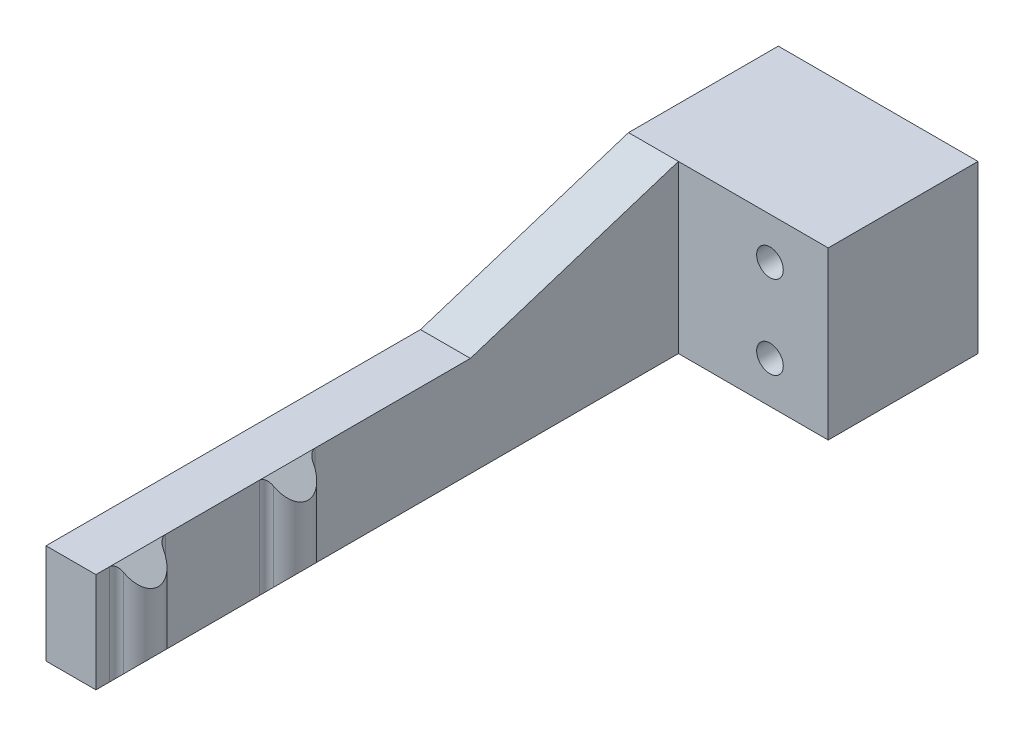
ISO-10303-21;
HEADER;
FILE_DESCRIPTION(('STEP AP214'),'2;1');
FILE_NAME('part.step','',(''),(''),'','','');
FILE_SCHEMA(('AUTOMOTIVE_DESIGN { 1 0 10303 214 1 1 1 1 }'));
ENDSEC;
DATA;
#1=APPLICATION_CONTEXT('core data for automotive mechanical design processes');
#2=APPLICATION_PROTOCOL_DEFINITION('international standard','automotive_design',2000,#1);
#3=PRODUCT_CONTEXT('',#1,'mechanical');
#4=PRODUCT('Part','Part','',(#3));
#5=PRODUCT_RELATED_PRODUCT_CATEGORY('part','',(#4));
#6=PRODUCT_DEFINITION_FORMATION('','',#4);
#7=PRODUCT_DEFINITION_CONTEXT('part definition',#1,'design');
#8=PRODUCT_DEFINITION('design','',#6,#7);
#9=PRODUCT_DEFINITION_SHAPE('','',#8);
#10=(LENGTH_UNIT() NAMED_UNIT(*) SI_UNIT(.MILLI.,.METRE.));
#11=(NAMED_UNIT(*) PLANE_ANGLE_UNIT() SI_UNIT($,.RADIAN.));
#12=(NAMED_UNIT(*) SI_UNIT($,.STERADIAN.) SOLID_ANGLE_UNIT());
#13=UNCERTAINTY_MEASURE_WITH_UNIT(LENGTH_MEASURE(1.E-05),#10,'distance_accuracy_value','');
#14=(GEOMETRIC_REPRESENTATION_CONTEXT(3) GLOBAL_UNCERTAINTY_ASSIGNED_CONTEXT((#13)) GLOBAL_UNIT_ASSIGNED_CONTEXT((#10,
#11,#12)) REPRESENTATION_CONTEXT('',''));
#15=CARTESIAN_POINT('',(0.,0.,0.));
#16=DIRECTION('',(0.,0.,1.));
#17=DIRECTION('',(1.,0.,0.));
#18=AXIS2_PLACEMENT_3D('',#15,#16,#17);
#19=CARTESIAN_POINT('',(-6.,0.,0.));
#20=DIRECTION('',(-1.,0.,0.));
#21=DIRECTION('',(0.,0.,1.));
#22=AXIS2_PLACEMENT_3D('',#19,#20,#21);
#23=PLANE('',#22);
#24=DIRECTION('',(0.,-1.,0.));
#25=VECTOR('',#24,1.);
#26=CARTESIAN_POINT('',(-6.,0.,68.3541019662497));
#27=LINE('',#26,#25);
#28=CARTESIAN_POINT('',(-6.,-10.,68.3541019662497));
#29=VERTEX_POINT('',#28);
#30=CARTESIAN_POINT('',(-6.,2.,68.3541019662497));
#31=VERTEX_POINT('',#30);
#32=EDGE_CURVE('E265',#29,#31,#27,.F.);
#33=ORIENTED_EDGE('',*,*,#32,.T.);
#34=DIRECTION('',(0.,0.,1.));
#35=VECTOR('',#34,1.);
#36=CARTESIAN_POINT('',(-6.,2.,0.));
#37=LINE('',#36,#35);
#38=CARTESIAN_POINT('',(-6.,2.,79.6458980337503));
#39=VERTEX_POINT('',#38);
#40=EDGE_CURVE('E192',#31,#39,#37,.T.);
#41=ORIENTED_EDGE('',*,*,#40,.T.);
#42=DIRECTION('',(0.,-1.,0.));
#43=VECTOR('',#42,1.);
#44=CARTESIAN_POINT('',(-6.,0.,79.6458980337503));
#45=LINE('',#44,#43);
#46=CARTESIAN_POINT('',(-6.,-10.,79.6458980337503));
#47=VERTEX_POINT('',#46);
#48=EDGE_CURVE('E260',#39,#47,#45,.T.);
#49=ORIENTED_EDGE('',*,*,#48,.T.);
#50=DIRECTION('',(0.,0.,1.));
#51=VECTOR('',#50,1.);
#52=CARTESIAN_POINT('',(-6.,-10.,0.));
#53=LINE('',#52,#51);
#54=EDGE_CURVE('E333',#29,#47,#53,.T.);
#55=ORIENTED_EDGE('',*,*,#54,.F.);
#56=EDGE_LOOP('',(#33,#41,#49,#55));
#57=FACE_BOUND('',#56,.T.);
#58=ADVANCED_FACE('F43',(#57),#23,.F.);
#59=CARTESIAN_POINT('',(-6.,-10.,86.3541019662497));
#60=VERTEX_POINT('',#59);
#61=CARTESIAN_POINT('',(-6.,-10.,88.));
#62=VERTEX_POINT('',#61);
#63=EDGE_CURVE('E328',#60,#62,#53,.T.);
#64=ORIENTED_EDGE('',*,*,#63,.F.);
#65=DIRECTION('',(0.,-1.,0.));
#66=VECTOR('',#65,1.);
#67=CARTESIAN_POINT('',(-6.,0.,86.3541019662497));
#68=LINE('',#67,#66);
#69=CARTESIAN_POINT('',(-6.,2.,86.3541019662497));
#70=VERTEX_POINT('',#69);
#71=EDGE_CURVE('E262',#60,#70,#68,.F.);
#72=ORIENTED_EDGE('',*,*,#71,.T.);
#73=CARTESIAN_POINT('',(-6.,2.,88.));
#74=VERTEX_POINT('',#73);
#75=EDGE_CURVE('E193',#70,#74,#37,.T.);
#76=ORIENTED_EDGE('',*,*,#75,.T.);
#77=DIRECTION('',(0.,-1.,0.));
#78=VECTOR('',#77,1.);
#79=CARTESIAN_POINT('',(-6.,0.,88.));
#80=LINE('',#79,#78);
#81=EDGE_CURVE('E187',#74,#62,#80,.T.);
#82=ORIENTED_EDGE('',*,*,#81,.T.);
#83=EDGE_LOOP('',(#64,#72,#76,#82));
#84=FACE_BOUND('',#83,.T.);
#85=ADVANCED_FACE('F355',(#84),#23,.F.);
#86=CARTESIAN_POINT('',(-6.,2.,43.));
#87=VERTEX_POINT('',#86);
#88=CARTESIAN_POINT('',(-6.,2.,61.6458980337503));
#89=VERTEX_POINT('',#88);
#90=EDGE_CURVE('E171',#87,#89,#37,.T.);
#91=ORIENTED_EDGE('',*,*,#90,.T.);
#92=DIRECTION('',(0.,-1.,0.));
#93=VECTOR('',#92,1.);
#94=CARTESIAN_POINT('',(-6.,0.,61.6458980337503));
#95=LINE('',#94,#93);
#96=CARTESIAN_POINT('',(-6.,-10.,61.6458980337503));
#97=VERTEX_POINT('',#96);
#98=EDGE_CURVE('E257',#89,#97,#95,.T.);
#99=ORIENTED_EDGE('',*,*,#98,.T.);
#100=CARTESIAN_POINT('',(-6.,-10.,18.));
#101=VERTEX_POINT('',#100);
#102=EDGE_CURVE('E324',#101,#97,#53,.T.);
#103=ORIENTED_EDGE('',*,*,#102,.F.);
#104=DIRECTION('',(0.,1.,0.));
#105=VECTOR('',#104,1.);
#106=CARTESIAN_POINT('',(-6.,0.,18.));
#107=LINE('',#106,#105);
#108=CARTESIAN_POINT('',(-6.,10.,18.));
#109=VERTEX_POINT('',#108);
#110=EDGE_CURVE('E173',#101,#109,#107,.T.);
#111=ORIENTED_EDGE('',*,*,#110,.T.);
#112=DIRECTION('',(0.,-0.304775727103784,0.952424147199324));
#113=VECTOR('',#112,1.);
#114=CARTESIAN_POINT('',(-6.,14.2960812772134,4.57474600870827));
#115=LINE('',#114,#113);
#116=EDGE_CURVE('E170',#109,#87,#115,.T.);
#117=ORIENTED_EDGE('',*,*,#116,.T.);
#118=EDGE_LOOP('',(#91,#99,#103,#111,#117));
#119=FACE_BOUND('',#118,.T.);
#120=ADVANCED_FACE('F169',(#119),#23,.F.);
#121=CARTESIAN_POINT('',(0.,0.,18.));
#122=DIRECTION('',(0.,0.,-1.));
#123=DIRECTION('',(-1.,0.,0.));
#124=AXIS2_PLACEMENT_3D('',#121,#122,#123);
#125=PLANE('',#124);
#126=CARTESIAN_POINT('',(5.,-5.,18.));
#127=DIRECTION('',(0.,0.,1.));
#128=DIRECTION('',(1.,0.,0.));
#129=AXIS2_PLACEMENT_3D('',#126,#127,#128);
#130=CIRCLE('',#129,1.6);
#131=CARTESIAN_POINT('',(6.6,-5.,18.));
#132=VERTEX_POINT('',#131);
#133=EDGE_CURVE('E213',#132,#132,#130,.T.);
#134=ORIENTED_EDGE('',*,*,#133,.F.);
#135=EDGE_LOOP('',(#134));
#136=FACE_BOUND('',#135,.T.);
#137=CARTESIAN_POINT('',(5.,5.,18.));
#138=DIRECTION('',(0.,0.,1.));
#139=DIRECTION('',(1.,0.,0.));
#140=AXIS2_PLACEMENT_3D('',#137,#138,#139);
#141=CIRCLE('',#140,1.6);
#142=CARTESIAN_POINT('',(6.6,5.,18.));
#143=VERTEX_POINT('',#142);
#144=EDGE_CURVE('E221',#143,#143,#141,.T.);
#145=ORIENTED_EDGE('',*,*,#144,.F.);
#146=EDGE_LOOP('',(#145));
#147=FACE_BOUND('',#146,.T.);
#148=ORIENTED_EDGE('',*,*,#110,.F.);
#149=DIRECTION('',(1.,0.,0.));
#150=VECTOR('',#149,1.);
#151=CARTESIAN_POINT('',(-12.,-10.,18.));
#152=LINE('',#151,#150);
#153=CARTESIAN_POINT('',(12.,-10.,18.));
#154=VERTEX_POINT('',#153);
#155=EDGE_CURVE('E240',#101,#154,#152,.T.);
#156=ORIENTED_EDGE('',*,*,#155,.T.);
#157=DIRECTION('',(0.,1.,0.));
#158=VECTOR('',#157,1.);
#159=CARTESIAN_POINT('',(12.,-10.,18.));
#160=LINE('',#159,#158);
#161=CARTESIAN_POINT('',(12.,10.,18.));
#162=VERTEX_POINT('',#161);
#163=EDGE_CURVE('E233',#154,#162,#160,.T.);
#164=ORIENTED_EDGE('',*,*,#163,.T.);
#165=DIRECTION('',(-1.,0.,0.));
#166=VECTOR('',#165,1.);
#167=CARTESIAN_POINT('',(-12.,10.,18.));
#168=LINE('',#167,#166);
#169=EDGE_CURVE('E234',#162,#109,#168,.T.);
#170=ORIENTED_EDGE('',*,*,#169,.T.);
#171=EDGE_LOOP('',(#148,#156,#164,#170));
#172=FACE_BOUND('',#171,.T.);
#173=ADVANCED_FACE('F360',(#136,#147,#172),#125,.F.);
#174=CARTESIAN_POINT('',(12.,-10.,18.));
#175=DIRECTION('',(-1.,0.,0.));
#176=DIRECTION('',(0.,0.,1.));
#177=AXIS2_PLACEMENT_3D('',#174,#175,#176);
#178=PLANE('',#177);
#179=DIRECTION('',(0.,1.,0.));
#180=VECTOR('',#179,1.);
#181=CARTESIAN_POINT('',(12.,-10.,0.));
#182=LINE('',#181,#180);
#183=CARTESIAN_POINT('',(12.,-10.,0.));
#184=VERTEX_POINT('',#183);
#185=CARTESIAN_POINT('',(12.,10.,0.));
#186=VERTEX_POINT('',#185);
#187=EDGE_CURVE('E225',#184,#186,#182,.T.);
#188=ORIENTED_EDGE('',*,*,#187,.T.);
#189=DIRECTION('',(0.,0.,-1.));
#190=VECTOR('',#189,1.);
#191=CARTESIAN_POINT('',(12.,10.,18.));
#192=LINE('',#191,#190);
#193=EDGE_CURVE('E253',#162,#186,#192,.T.);
#194=ORIENTED_EDGE('',*,*,#193,.F.);
#195=ORIENTED_EDGE('',*,*,#163,.F.);
#196=DIRECTION('',(0.,0.,-1.));
#197=VECTOR('',#196,1.);
#198=CARTESIAN_POINT('',(12.,-10.,18.));
#199=LINE('',#198,#197);
#200=EDGE_CURVE('E237',#154,#184,#199,.T.);
#201=ORIENTED_EDGE('',*,*,#200,.T.);
#202=EDGE_LOOP('',(#188,#194,#195,#201));
#203=FACE_BOUND('',#202,.T.);
#204=ADVANCED_FACE('F379',(#203),#178,.F.);
#205=CARTESIAN_POINT('',(-12.,10.,18.));
#206=DIRECTION('',(0.,-1.,0.));
#207=DIRECTION('',(0.,0.,-1.));
#208=AXIS2_PLACEMENT_3D('',#205,#206,#207);
#209=PLANE('',#208);
#210=DIRECTION('',(-1.,0.,0.));
#211=VECTOR('',#210,1.);
#212=CARTESIAN_POINT('',(-12.,10.,0.));
#213=LINE('',#212,#211);
#214=CARTESIAN_POINT('',(-12.,10.,0.));
#215=VERTEX_POINT('',#214);
#216=EDGE_CURVE('E245',#186,#215,#213,.T.);
#217=ORIENTED_EDGE('',*,*,#216,.T.);
#218=DIRECTION('',(0.,0.,-1.));
#219=VECTOR('',#218,1.);
#220=CARTESIAN_POINT('',(-12.,10.,18.));
#221=LINE('',#220,#219);
#222=CARTESIAN_POINT('',(-12.,10.,18.));
#223=VERTEX_POINT('',#222);
#224=EDGE_CURVE('E255',#223,#215,#221,.T.);
#225=ORIENTED_EDGE('',*,*,#224,.F.);
#226=DIRECTION('',(-1.,0.,0.));
#227=VECTOR('',#226,1.);
#228=CARTESIAN_POINT('',(-6.,10.,18.));
#229=LINE('',#228,#227);
#230=EDGE_CURVE('E184',#109,#223,#229,.T.);
#231=ORIENTED_EDGE('',*,*,#230,.F.);
#232=ORIENTED_EDGE('',*,*,#169,.F.);
#233=ORIENTED_EDGE('',*,*,#193,.T.);
#234=EDGE_LOOP('',(#217,#225,#231,#232,#233));
#235=FACE_BOUND('',#234,.T.);
#236=ADVANCED_FACE('F387',(#235),#209,.F.);
#237=CARTESIAN_POINT('',(-12.,-10.,18.));
#238=DIRECTION('',(1.,0.,0.));
#239=DIRECTION('',(0.,0.,-1.));
#240=AXIS2_PLACEMENT_3D('',#237,#238,#239);
#241=PLANE('',#240);
#242=DIRECTION('',(0.,-1.,0.));
#243=VECTOR('',#242,1.);
#244=CARTESIAN_POINT('',(-12.,-10.,0.));
#245=LINE('',#244,#243);
#246=CARTESIAN_POINT('',(-12.,-10.,0.));
#247=VERTEX_POINT('',#246);
#248=EDGE_CURVE('E242',#215,#247,#245,.T.);
#249=ORIENTED_EDGE('',*,*,#248,.T.);
#250=DIRECTION('',(0.,0.,-1.));
#251=VECTOR('',#250,1.);
#252=CARTESIAN_POINT('',(-12.,-10.,18.));
#253=LINE('',#252,#251);
#254=CARTESIAN_POINT('',(-12.,-10.,88.));
#255=VERTEX_POINT('',#254);
#256=EDGE_CURVE('E248',#255,#247,#253,.T.);
#257=ORIENTED_EDGE('',*,*,#256,.F.);
#258=DIRECTION('',(0.,-1.,0.));
#259=VECTOR('',#258,1.);
#260=CARTESIAN_POINT('',(-12.,0.,88.));
#261=LINE('',#260,#259);
#262=CARTESIAN_POINT('',(-12.,2.,88.));
#263=VERTEX_POINT('',#262);
#264=EDGE_CURVE('E200',#263,#255,#261,.T.);
#265=ORIENTED_EDGE('',*,*,#264,.F.);
#266=DIRECTION('',(0.,0.,1.));
#267=VECTOR('',#266,1.);
#268=CARTESIAN_POINT('',(-12.,2.,0.));
#269=LINE('',#268,#267);
#270=CARTESIAN_POINT('',(-12.,2.,43.));
#271=VERTEX_POINT('',#270);
#272=EDGE_CURVE('E206',#271,#263,#269,.T.);
#273=ORIENTED_EDGE('',*,*,#272,.F.);
#274=DIRECTION('',(0.,-0.304775727103784,0.952424147199324));
#275=VECTOR('',#274,1.);
#276=CARTESIAN_POINT('',(-12.,14.2960812772134,4.57474600870827));
#277=LINE('',#276,#275);
#278=EDGE_CURVE('E181',#223,#271,#277,.T.);
#279=ORIENTED_EDGE('',*,*,#278,.F.);
#280=ORIENTED_EDGE('',*,*,#224,.T.);
#281=EDGE_LOOP('',(#249,#257,#265,#273,#279,#280));
#282=FACE_BOUND('',#281,.T.);
#283=ADVANCED_FACE('F386',(#282),#241,.F.);
#284=CARTESIAN_POINT('',(-12.,-10.,18.));
#285=DIRECTION('',(0.,1.,0.));
#286=DIRECTION('',(0.,0.,1.));
#287=AXIS2_PLACEMENT_3D('',#284,#285,#286);
#288=PLANE('',#287);
#289=DIRECTION('',(1.,0.,0.));
#290=VECTOR('',#289,1.);
#291=CARTESIAN_POINT('',(-12.,-10.,0.));
#292=LINE('',#291,#290);
#293=EDGE_CURVE('E232',#247,#184,#292,.T.);
#294=ORIENTED_EDGE('',*,*,#293,.T.);
#295=ORIENTED_EDGE('',*,*,#200,.F.);
#296=ORIENTED_EDGE('',*,*,#155,.F.);
#297=ORIENTED_EDGE('',*,*,#102,.T.);
#298=EDGE_CURVE('E323',#97,#29,#53,.T.);
#299=ORIENTED_EDGE('',*,*,#298,.T.);
#300=ORIENTED_EDGE('',*,*,#54,.T.);
#301=EDGE_CURVE('E326',#47,#60,#53,.T.);
#302=ORIENTED_EDGE('',*,*,#301,.T.);
#303=ORIENTED_EDGE('',*,*,#63,.T.);
#304=DIRECTION('',(-1.,0.,0.));
#305=VECTOR('',#304,1.);
#306=CARTESIAN_POINT('',(-6.,-10.,88.));
#307=LINE('',#306,#305);
#308=EDGE_CURVE('E212',#62,#255,#307,.T.);
#309=ORIENTED_EDGE('',*,*,#308,.T.);
#310=ORIENTED_EDGE('',*,*,#256,.T.);
#311=EDGE_LOOP('',(#294,#295,#296,#297,#299,#300,#302,#303,#309,#310));
#312=FACE_BOUND('',#311,.T.);
#313=ADVANCED_FACE('F340',(#312),#288,.F.);
#314=CARTESIAN_POINT('',(0.,0.,0.));
#315=DIRECTION('',(0.,0.,-1.));
#316=DIRECTION('',(-1.,0.,0.));
#317=AXIS2_PLACEMENT_3D('',#314,#315,#316);
#318=PLANE('',#317);
#319=CARTESIAN_POINT('',(5.,5.,0.));
#320=DIRECTION('',(0.,0.,1.));
#321=DIRECTION('',(1.,0.,0.));
#322=AXIS2_PLACEMENT_3D('',#319,#320,#321);
#323=CIRCLE('',#322,1.6);
#324=CARTESIAN_POINT('',(6.6,5.,0.));
#325=VERTEX_POINT('',#324);
#326=EDGE_CURVE('E217',#325,#325,#323,.T.);
#327=ORIENTED_EDGE('',*,*,#326,.T.);
#328=EDGE_LOOP('',(#327));
#329=FACE_BOUND('',#328,.T.);
#330=CARTESIAN_POINT('',(5.,-5.,0.));
#331=DIRECTION('',(0.,0.,1.));
#332=DIRECTION('',(1.,0.,0.));
#333=AXIS2_PLACEMENT_3D('',#330,#331,#332);
#334=CIRCLE('',#333,1.6);
#335=CARTESIAN_POINT('',(6.6,-5.,0.));
#336=VERTEX_POINT('',#335);
#337=EDGE_CURVE('E228',#336,#336,#334,.T.);
#338=ORIENTED_EDGE('',*,*,#337,.T.);
#339=EDGE_LOOP('',(#338));
#340=FACE_BOUND('',#339,.T.);
#341=ORIENTED_EDGE('',*,*,#187,.F.);
#342=ORIENTED_EDGE('',*,*,#293,.F.);
#343=ORIENTED_EDGE('',*,*,#248,.F.);
#344=ORIENTED_EDGE('',*,*,#216,.F.);
#345=EDGE_LOOP('',(#341,#342,#343,#344));
#346=FACE_BOUND('',#345,.T.);
#347=ADVANCED_FACE('F376',(#329,#340,#346),#318,.T.);
#348=CARTESIAN_POINT('',(5.,-5.,0.));
#349=DIRECTION('',(0.,0.,1.));
#350=DIRECTION('',(1.,0.,0.));
#351=AXIS2_PLACEMENT_3D('',#348,#349,#350);
#352=CYLINDRICAL_SURFACE('',#351,1.6);
#353=ORIENTED_EDGE('',*,*,#337,.F.);
#354=EDGE_LOOP('',(#353));
#355=FACE_BOUND('',#354,.T.);
#356=ORIENTED_EDGE('',*,*,#133,.T.);
#357=EDGE_LOOP('',(#356));
#358=FACE_BOUND('',#357,.T.);
#359=ADVANCED_FACE('F375',(#355,#358),#352,.F.);
#360=CARTESIAN_POINT('',(5.,5.,0.));
#361=DIRECTION('',(0.,0.,1.));
#362=DIRECTION('',(1.,0.,0.));
#363=AXIS2_PLACEMENT_3D('',#360,#361,#362);
#364=CYLINDRICAL_SURFACE('',#363,1.6);
#365=ORIENTED_EDGE('',*,*,#326,.F.);
#366=EDGE_LOOP('',(#365));
#367=FACE_BOUND('',#366,.T.);
#368=ORIENTED_EDGE('',*,*,#144,.T.);
#369=EDGE_LOOP('',(#368));
#370=FACE_BOUND('',#369,.T.);
#371=ADVANCED_FACE('F367',(#367,#370),#364,.F.);
#372=CARTESIAN_POINT('',(-6.,2.,0.));
#373=DIRECTION('',(0.,-1.,0.));
#374=DIRECTION('',(0.,0.,-1.));
#375=AXIS2_PLACEMENT_3D('',#372,#373,#374);
#376=PLANE('',#375);
#377=ORIENTED_EDGE('',*,*,#272,.T.);
#378=DIRECTION('',(-1.,0.,0.));
#379=VECTOR('',#378,1.);
#380=CARTESIAN_POINT('',(-6.,2.,88.));
#381=LINE('',#380,#379);
#382=EDGE_CURVE('E211',#74,#263,#381,.T.);
#383=ORIENTED_EDGE('',*,*,#382,.F.);
#384=ORIENTED_EDGE('',*,*,#75,.F.);
#385=EDGE_CURVE('E198',#39,#70,#37,.T.);
#386=ORIENTED_EDGE('',*,*,#385,.F.);
#387=ORIENTED_EDGE('',*,*,#40,.F.);
#388=EDGE_CURVE('E191',#89,#31,#37,.T.);
#389=ORIENTED_EDGE('',*,*,#388,.F.);
#390=ORIENTED_EDGE('',*,*,#90,.F.);
#391=DIRECTION('',(-1.,0.,0.));
#392=VECTOR('',#391,1.);
#393=CARTESIAN_POINT('',(-6.,2.,43.));
#394=LINE('',#393,#392);
#395=EDGE_CURVE('E178',#87,#271,#394,.T.);
#396=ORIENTED_EDGE('',*,*,#395,.T.);
#397=EDGE_LOOP('',(#377,#383,#384,#386,#387,#389,#390,#396));
#398=FACE_BOUND('',#397,.T.);
#399=ADVANCED_FACE('F186',(#398),#376,.F.);
#400=CARTESIAN_POINT('',(-6.,0.,88.));
#401=DIRECTION('',(0.,0.,-1.));
#402=DIRECTION('',(-1.,0.,0.));
#403=AXIS2_PLACEMENT_3D('',#400,#401,#402);
#404=PLANE('',#403);
#405=ORIENTED_EDGE('',*,*,#264,.T.);
#406=ORIENTED_EDGE('',*,*,#308,.F.);
#407=ORIENTED_EDGE('',*,*,#81,.F.);
#408=ORIENTED_EDGE('',*,*,#382,.T.);
#409=EDGE_LOOP('',(#405,#406,#407,#408));
#410=FACE_BOUND('',#409,.T.);
#411=ADVANCED_FACE('F316',(#410),#404,.F.);
#412=CARTESIAN_POINT('',(-6.,14.2960812772134,4.57474600870827));
#413=DIRECTION('',(0.,-0.952424147199324,-0.304775727103784));
#414=DIRECTION('',(0.,0.304775727103784,-0.952424147199324));
#415=AXIS2_PLACEMENT_3D('',#412,#413,#414);
#416=PLANE('',#415);
#417=ORIENTED_EDGE('',*,*,#278,.T.);
#418=ORIENTED_EDGE('',*,*,#395,.F.);
#419=ORIENTED_EDGE('',*,*,#116,.F.);
#420=ORIENTED_EDGE('',*,*,#230,.T.);
#421=EDGE_LOOP('',(#417,#418,#419,#420));
#422=FACE_BOUND('',#421,.T.);
#423=ADVANCED_FACE('F177',(#422),#416,.F.);
#424=CARTESIAN_POINT('',(-6.,-0.5,83.));
#425=DIRECTION('',(0.,-1.,0.));
#426=DIRECTION('',(0.,0.,-1.));
#427=AXIS2_PLACEMENT_3D('',#424,#425,#426);
#428=CYLINDRICAL_SURFACE('',#427,2.5);
#429=DIRECTION('',(0.,-1.,0.));
#430=VECTOR('',#429,1.);
#431=CARTESIAN_POINT('',(-5.28571428571429,-0.5,80.6042128812502));
#432=LINE('',#431,#430);
#433=CARTESIAN_POINT('',(-5.28571428571429,-9.28571428571429,80.6042128812502));
#434=VERTEX_POINT('',#433);
#435=CARTESIAN_POINT('',(-5.28571428571429,1.28571428571429,80.6042128812502));
#436=VERTEX_POINT('',#435);
#437=EDGE_CURVE('E59',#434,#436,#432,.F.);
#438=ORIENTED_EDGE('',*,*,#437,.T.);
#439=CARTESIAN_POINT('',(-6.,2.,83.));
#440=DIRECTION('',(0.707106781186543,0.707106781186551,0.));
#441=DIRECTION('',(0.707106781186551,-0.707106781186544,0.));
#442=AXIS2_PLACEMENT_3D('',#439,#440,#441);
#443=ELLIPSE('',#442,3.53553390593272,2.5);
#444=CARTESIAN_POINT('',(-3.49999999999997,-0.5,83.));
#445=VERTEX_POINT('',#444);
#446=EDGE_CURVE('E11',#436,#445,#443,.F.);
#447=ORIENTED_EDGE('',*,*,#446,.T.);
#448=CARTESIAN_POINT('',(-6.,2.,83.));
#449=DIRECTION('',(0.707106781186543,0.707106781186551,0.));
#450=DIRECTION('',(0.707106781186551,-0.707106781186544,0.));
#451=AXIS2_PLACEMENT_3D('',#448,#449,#450);
#452=ELLIPSE('',#451,3.53553390593272,2.5);
#453=CARTESIAN_POINT('',(-5.28571428571429,1.28571428571429,85.3957871187498));
#454=VERTEX_POINT('',#453);
#455=EDGE_CURVE('E303',#445,#454,#452,.F.);
#456=ORIENTED_EDGE('',*,*,#455,.T.);
#457=DIRECTION('',(0.,-1.,0.));
#458=VECTOR('',#457,1.);
#459=CARTESIAN_POINT('',(-5.28571428571429,-0.5,85.3957871187498));
#460=LINE('',#459,#458);
#461=CARTESIAN_POINT('',(-5.28571428571429,-9.28571428571429,85.3957871187498));
#462=VERTEX_POINT('',#461);
#463=EDGE_CURVE('E68',#454,#462,#460,.T.);
#464=ORIENTED_EDGE('',*,*,#463,.T.);
#465=CARTESIAN_POINT('',(-6.,-10.,83.));
#466=DIRECTION('',(-0.707106781186551,0.707106781186544,0.));
#467=DIRECTION('',(-0.707106781186544,-0.707106781186551,0.));
#468=AXIS2_PLACEMENT_3D('',#465,#466,#467);
#469=ELLIPSE('',#468,3.53553390593276,2.5);
#470=CARTESIAN_POINT('',(-3.50000000000001,-7.5,83.));
#471=VERTEX_POINT('',#470);
#472=EDGE_CURVE('E298',#462,#471,#469,.T.);
#473=ORIENTED_EDGE('',*,*,#472,.T.);
#474=CARTESIAN_POINT('',(-6.,-10.,83.));
#475=DIRECTION('',(-0.707106781186551,0.707106781186544,0.));
#476=DIRECTION('',(-0.707106781186544,-0.707106781186551,0.));
#477=AXIS2_PLACEMENT_3D('',#474,#475,#476);
#478=ELLIPSE('',#477,3.53553390593276,2.5);
#479=EDGE_CURVE('E296',#471,#434,#478,.T.);
#480=ORIENTED_EDGE('',*,*,#479,.T.);
#481=EDGE_LOOP('',(#438,#447,#456,#464,#473,#480));
#482=FACE_BOUND('',#481,.T.);
#483=ADVANCED_FACE('F313',(#482),#428,.T.);
#484=CARTESIAN_POINT('',(-6.,-0.5,65.));
#485=DIRECTION('',(0.,-1.,0.));
#486=DIRECTION('',(0.,0.,-1.));
#487=AXIS2_PLACEMENT_3D('',#484,#485,#486);
#488=CYLINDRICAL_SURFACE('',#487,2.5);
#489=DIRECTION('',(0.,-1.,0.));
#490=VECTOR('',#489,1.);
#491=CARTESIAN_POINT('',(-5.28571428571428,-0.5,62.6042128812502));
#492=LINE('',#491,#490);
#493=CARTESIAN_POINT('',(-5.28571428571428,-9.28571428571429,62.6042128812502));
#494=VERTEX_POINT('',#493);
#495=CARTESIAN_POINT('',(-5.28571428571428,1.28571428571429,62.6042128812502));
#496=VERTEX_POINT('',#495);
#497=EDGE_CURVE('E266',#494,#496,#492,.F.);
#498=ORIENTED_EDGE('',*,*,#497,.T.);
#499=CARTESIAN_POINT('',(-6.,2.,65.));
#500=DIRECTION('',(0.707106781186543,0.707106781186551,0.));
#501=DIRECTION('',(0.707106781186551,-0.707106781186544,0.));
#502=AXIS2_PLACEMENT_3D('',#499,#500,#501);
#503=ELLIPSE('',#502,3.53553390593272,2.5);
#504=CARTESIAN_POINT('',(-3.49999999999997,-0.5,65.));
#505=VERTEX_POINT('',#504);
#506=EDGE_CURVE('E283',#496,#505,#503,.F.);
#507=ORIENTED_EDGE('',*,*,#506,.T.);
#508=CARTESIAN_POINT('',(-6.,2.,65.));
#509=DIRECTION('',(0.707106781186543,0.707106781186551,0.));
#510=DIRECTION('',(0.707106781186551,-0.707106781186544,0.));
#511=AXIS2_PLACEMENT_3D('',#508,#509,#510);
#512=ELLIPSE('',#511,3.53553390593272,2.5);
#513=CARTESIAN_POINT('',(-5.28571428571429,1.28571428571429,67.3957871187498));
#514=VERTEX_POINT('',#513);
#515=EDGE_CURVE('E275',#505,#514,#512,.F.);
#516=ORIENTED_EDGE('',*,*,#515,.T.);
#517=DIRECTION('',(0.,-1.,0.));
#518=VECTOR('',#517,1.);
#519=CARTESIAN_POINT('',(-5.28571428571429,-0.5,67.3957871187498));
#520=LINE('',#519,#518);
#521=CARTESIAN_POINT('',(-5.28571428571429,-9.28571428571429,67.3957871187498));
#522=VERTEX_POINT('',#521);
#523=EDGE_CURVE('E267',#514,#522,#520,.T.);
#524=ORIENTED_EDGE('',*,*,#523,.T.);
#525=CARTESIAN_POINT('',(-6.,-10.,65.));
#526=DIRECTION('',(-0.707106781186551,0.707106781186544,0.));
#527=DIRECTION('',(-0.707106781186544,-0.707106781186551,0.));
#528=AXIS2_PLACEMENT_3D('',#525,#526,#527);
#529=ELLIPSE('',#528,3.53553390593276,2.5);
#530=CARTESIAN_POINT('',(-3.50000000000001,-7.5,65.));
#531=VERTEX_POINT('',#530);
#532=EDGE_CURVE('E288',#522,#531,#529,.T.);
#533=ORIENTED_EDGE('',*,*,#532,.T.);
#534=CARTESIAN_POINT('',(-6.,-10.,65.));
#535=DIRECTION('',(-0.707106781186551,0.707106781186544,0.));
#536=DIRECTION('',(-0.707106781186544,-0.707106781186551,0.));
#537=AXIS2_PLACEMENT_3D('',#534,#535,#536);
#538=ELLIPSE('',#537,3.53553390593276,2.5);
#539=EDGE_CURVE('E286',#531,#494,#538,.T.);
#540=ORIENTED_EDGE('',*,*,#539,.T.);
#541=EDGE_LOOP('',(#498,#507,#516,#524,#533,#540));
#542=FACE_BOUND('',#541,.T.);
#543=ADVANCED_FACE('F402',(#542),#488,.T.);
#544=CARTESIAN_POINT('',(-5.,-0.5,86.3541019662497));
#545=DIRECTION('',(0.,-1.,0.));
#546=DIRECTION('',(0.,0.,-1.));
#547=AXIS2_PLACEMENT_3D('',#544,#545,#546);
#548=CYLINDRICAL_SURFACE('',#547,1.);
#549=ORIENTED_EDGE('',*,*,#71,.F.);
#550=CARTESIAN_POINT('',(-5.,-9.00000000000001,86.3541019662497));
#551=DIRECTION('',(-0.707106781186551,0.707106781186544,0.));
#552=DIRECTION('',(-0.707106781186544,-0.707106781186551,0.));
#553=AXIS2_PLACEMENT_3D('',#550,#551,#552);
#554=ELLIPSE('',#553,1.4142135623731,1.);
#555=EDGE_CURVE('E295',#60,#462,#554,.F.);
#556=ORIENTED_EDGE('',*,*,#555,.T.);
#557=ORIENTED_EDGE('',*,*,#463,.F.);
#558=CARTESIAN_POINT('',(-5.,1.00000000000001,86.3541019662497));
#559=DIRECTION('',(0.707106781186543,0.707106781186551,0.));
#560=DIRECTION('',(0.707106781186551,-0.707106781186544,0.));
#561=AXIS2_PLACEMENT_3D('',#558,#559,#560);
#562=ELLIPSE('',#561,1.41421356237309,1.);
#563=EDGE_CURVE('E304',#454,#70,#562,.T.);
#564=ORIENTED_EDGE('',*,*,#563,.T.);
#565=EDGE_LOOP('',(#549,#556,#557,#564));
#566=FACE_BOUND('',#565,.T.);
#567=ADVANCED_FACE('F314',(#566),#548,.F.);
#568=CARTESIAN_POINT('',(-5.,-0.5,68.3541019662497));
#569=DIRECTION('',(0.,-1.,0.));
#570=DIRECTION('',(0.,0.,-1.));
#571=AXIS2_PLACEMENT_3D('',#568,#569,#570);
#572=CYLINDRICAL_SURFACE('',#571,1.);
#573=ORIENTED_EDGE('',*,*,#32,.F.);
#574=CARTESIAN_POINT('',(-5.,-9.00000000000001,68.3541019662497));
#575=DIRECTION('',(-0.707106781186551,0.707106781186544,0.));
#576=DIRECTION('',(-0.707106781186544,-0.707106781186551,0.));
#577=AXIS2_PLACEMENT_3D('',#574,#575,#576);
#578=ELLIPSE('',#577,1.4142135623731,1.);
#579=EDGE_CURVE('E281',#29,#522,#578,.F.);
#580=ORIENTED_EDGE('',*,*,#579,.T.);
#581=ORIENTED_EDGE('',*,*,#523,.F.);
#582=CARTESIAN_POINT('',(-5.,1.00000000000001,68.3541019662497));
#583=DIRECTION('',(0.707106781186543,0.707106781186551,0.));
#584=DIRECTION('',(0.707106781186551,-0.707106781186544,0.));
#585=AXIS2_PLACEMENT_3D('',#582,#583,#584);
#586=ELLIPSE('',#585,1.41421356237309,1.);
#587=EDGE_CURVE('E273',#514,#31,#586,.T.);
#588=ORIENTED_EDGE('',*,*,#587,.T.);
#589=EDGE_LOOP('',(#573,#580,#581,#588));
#590=FACE_BOUND('',#589,.T.);
#591=ADVANCED_FACE('F397',(#590),#572,.F.);
#592=CARTESIAN_POINT('',(-5.,-0.5,61.6458980337503));
#593=DIRECTION('',(0.,-1.,0.));
#594=DIRECTION('',(0.,0.,-1.));
#595=AXIS2_PLACEMENT_3D('',#592,#593,#594);
#596=CYLINDRICAL_SURFACE('',#595,1.);
#597=ORIENTED_EDGE('',*,*,#98,.F.);
#598=CARTESIAN_POINT('',(-5.,1.00000000000001,61.6458980337503));
#599=DIRECTION('',(0.707106781186543,0.707106781186551,0.));
#600=DIRECTION('',(0.707106781186551,-0.707106781186544,0.));
#601=AXIS2_PLACEMENT_3D('',#598,#599,#600);
#602=ELLIPSE('',#601,1.41421356237309,1.);
#603=EDGE_CURVE('E280',#89,#496,#602,.T.);
#604=ORIENTED_EDGE('',*,*,#603,.T.);
#605=ORIENTED_EDGE('',*,*,#497,.F.);
#606=CARTESIAN_POINT('',(-5.,-9.00000000000001,61.6458980337503));
#607=DIRECTION('',(-0.707106781186551,0.707106781186544,0.));
#608=DIRECTION('',(-0.707106781186544,-0.707106781186551,0.));
#609=AXIS2_PLACEMENT_3D('',#606,#607,#608);
#610=ELLIPSE('',#609,1.4142135623731,1.);
#611=EDGE_CURVE('E293',#494,#97,#610,.F.);
#612=ORIENTED_EDGE('',*,*,#611,.T.);
#613=EDGE_LOOP('',(#597,#604,#605,#612));
#614=FACE_BOUND('',#613,.T.);
#615=ADVANCED_FACE('F404',(#614),#596,.F.);
#616=CARTESIAN_POINT('',(-5.,-0.5,79.6458980337503));
#617=DIRECTION('',(0.,-1.,0.));
#618=DIRECTION('',(0.,0.,-1.));
#619=AXIS2_PLACEMENT_3D('',#616,#617,#618);
#620=CYLINDRICAL_SURFACE('',#619,1.);
#621=ORIENTED_EDGE('',*,*,#48,.F.);
#622=CARTESIAN_POINT('',(-5.,1.00000000000001,79.6458980337503));
#623=DIRECTION('',(0.707106781186543,0.707106781186551,0.));
#624=DIRECTION('',(0.707106781186551,-0.707106781186544,0.));
#625=AXIS2_PLACEMENT_3D('',#622,#623,#624);
#626=ELLIPSE('',#625,1.41421356237309,1.);
#627=EDGE_CURVE('E55',#39,#436,#626,.T.);
#628=ORIENTED_EDGE('',*,*,#627,.T.);
#629=ORIENTED_EDGE('',*,*,#437,.F.);
#630=CARTESIAN_POINT('',(-5.,-9.00000000000001,79.6458980337503));
#631=DIRECTION('',(-0.707106781186551,0.707106781186544,0.));
#632=DIRECTION('',(-0.707106781186544,-0.707106781186551,0.));
#633=AXIS2_PLACEMENT_3D('',#630,#631,#632);
#634=ELLIPSE('',#633,1.4142135623731,1.);
#635=EDGE_CURVE('E297',#434,#47,#634,.F.);
#636=ORIENTED_EDGE('',*,*,#635,.T.);
#637=EDGE_LOOP('',(#621,#628,#629,#636));
#638=FACE_BOUND('',#637,.T.);
#639=ADVANCED_FACE('F307',(#638),#620,.F.);
#640=CARTESIAN_POINT('',(-3.49999999999997,-0.5,65.));
#641=DIRECTION('',(0.707106781186543,0.707106781186551,0.));
#642=DIRECTION('',(0.,0.,-1.));
#643=AXIS2_PLACEMENT_3D('',#640,#641,#642);
#644=PLANE('',#643);
#645=ORIENTED_EDGE('',*,*,#603,.F.);
#646=ORIENTED_EDGE('',*,*,#388,.T.);
#647=ORIENTED_EDGE('',*,*,#587,.F.);
#648=ORIENTED_EDGE('',*,*,#515,.F.);
#649=ORIENTED_EDGE('',*,*,#506,.F.);
#650=EDGE_LOOP('',(#645,#646,#647,#648,#649));
#651=FACE_BOUND('',#650,.T.);
#652=ADVANCED_FACE('F407',(#651),#644,.T.);
#653=CARTESIAN_POINT('',(-6.,-10.,0.));
#654=DIRECTION('',(-0.707106781186551,0.707106781186544,0.));
#655=DIRECTION('',(0.,0.,1.));
#656=AXIS2_PLACEMENT_3D('',#653,#654,#655);
#657=PLANE('',#656);
#658=ORIENTED_EDGE('',*,*,#611,.F.);
#659=ORIENTED_EDGE('',*,*,#539,.F.);
#660=ORIENTED_EDGE('',*,*,#532,.F.);
#661=ORIENTED_EDGE('',*,*,#579,.F.);
#662=ORIENTED_EDGE('',*,*,#298,.F.);
#663=EDGE_LOOP('',(#658,#659,#660,#661,#662));
#664=FACE_BOUND('',#663,.T.);
#665=ADVANCED_FACE('F341',(#664),#657,.F.);
#666=CARTESIAN_POINT('',(-6.,-10.,0.));
#667=DIRECTION('',(-0.707106781186551,0.707106781186544,0.));
#668=DIRECTION('',(0.,0.,1.));
#669=AXIS2_PLACEMENT_3D('',#666,#667,#668);
#670=PLANE('',#669);
#671=ORIENTED_EDGE('',*,*,#635,.F.);
#672=ORIENTED_EDGE('',*,*,#479,.F.);
#673=ORIENTED_EDGE('',*,*,#472,.F.);
#674=ORIENTED_EDGE('',*,*,#555,.F.);
#675=ORIENTED_EDGE('',*,*,#301,.F.);
#676=EDGE_LOOP('',(#671,#672,#673,#674,#675));
#677=FACE_BOUND('',#676,.T.);
#678=ADVANCED_FACE('F349',(#677),#670,.F.);
#679=CARTESIAN_POINT('',(-3.49999999999997,-0.5,83.));
#680=DIRECTION('',(0.707106781186543,0.707106781186551,0.));
#681=DIRECTION('',(0.,0.,-1.));
#682=AXIS2_PLACEMENT_3D('',#679,#680,#681);
#683=PLANE('',#682);
#684=ORIENTED_EDGE('',*,*,#627,.F.);
#685=ORIENTED_EDGE('',*,*,#385,.T.);
#686=ORIENTED_EDGE('',*,*,#563,.F.);
#687=ORIENTED_EDGE('',*,*,#455,.F.);
#688=ORIENTED_EDGE('',*,*,#446,.F.);
#689=EDGE_LOOP('',(#684,#685,#686,#687,#688));
#690=FACE_BOUND('',#689,.T.);
#691=ADVANCED_FACE('F46',(#690),#683,.T.);
#692=CLOSED_SHELL('',(#58,#85,#120,#173,#204,#236,#283,#313,#347,#359,#371,#399,#411,#423,#483,
#543,#567,#591,#615,#639,#652,#665,#678,#691));
#693=MANIFOLD_SOLID_BREP('B2',#692);
#694=ADVANCED_BREP_SHAPE_REPRESENTATION('',(#18,#693),#14);
#695=SHAPE_DEFINITION_REPRESENTATION(#9,#694);
ENDSEC;
END-ISO-10303-21;
